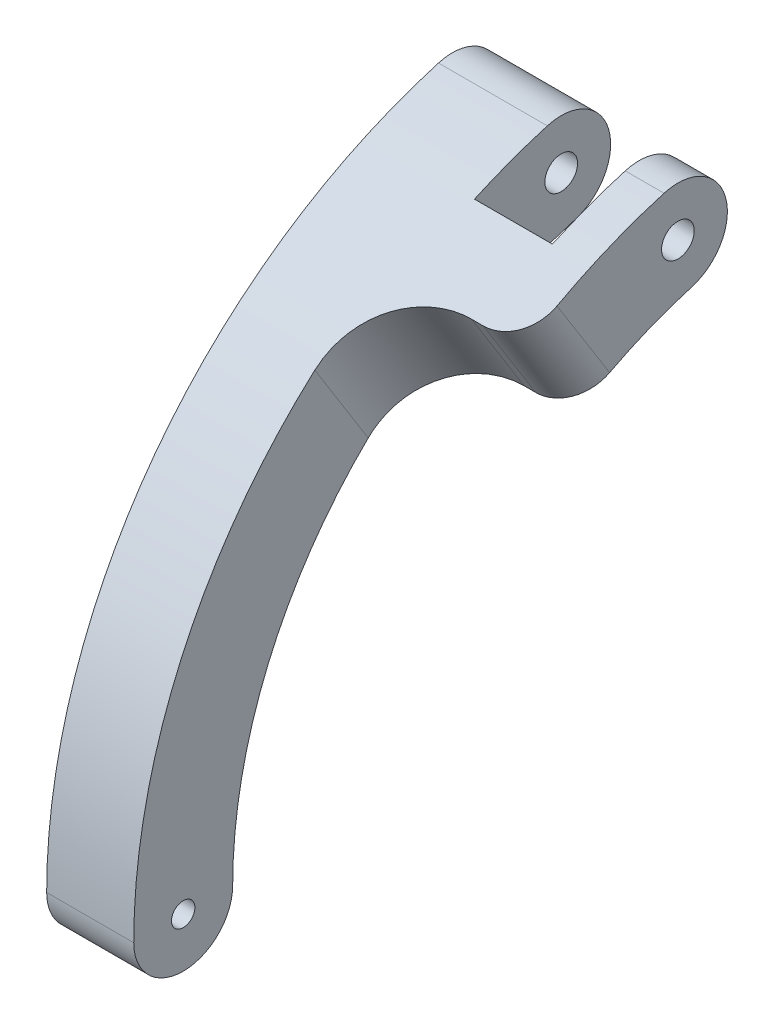
ISO-10303-21;
HEADER;
FILE_DESCRIPTION(('STEP AP214'),'2;1');
FILE_NAME('part.step','',(''),(''),'','','');
FILE_SCHEMA(('AUTOMOTIVE_DESIGN { 1 0 10303 214 1 1 1 1 }'));
ENDSEC;
DATA;
#1=APPLICATION_CONTEXT('core data for automotive mechanical design processes');
#2=APPLICATION_PROTOCOL_DEFINITION('international standard','automotive_design',2000,#1);
#3=PRODUCT_CONTEXT('',#1,'mechanical');
#4=PRODUCT('Part','Part','',(#3));
#5=PRODUCT_RELATED_PRODUCT_CATEGORY('part','',(#4));
#6=PRODUCT_DEFINITION_FORMATION('','',#4);
#7=PRODUCT_DEFINITION_CONTEXT('part definition',#1,'design');
#8=PRODUCT_DEFINITION('design','',#6,#7);
#9=PRODUCT_DEFINITION_SHAPE('','',#8);
#10=(LENGTH_UNIT() NAMED_UNIT(*) SI_UNIT(.MILLI.,.METRE.));
#11=(NAMED_UNIT(*) PLANE_ANGLE_UNIT() SI_UNIT($,.RADIAN.));
#12=(NAMED_UNIT(*) SI_UNIT($,.STERADIAN.) SOLID_ANGLE_UNIT());
#13=UNCERTAINTY_MEASURE_WITH_UNIT(LENGTH_MEASURE(1.E-05),#10,'distance_accuracy_value','');
#14=(GEOMETRIC_REPRESENTATION_CONTEXT(3) GLOBAL_UNCERTAINTY_ASSIGNED_CONTEXT((#13)) GLOBAL_UNIT_ASSIGNED_CONTEXT((#10,
#11,#12)) REPRESENTATION_CONTEXT('',''));
#15=CARTESIAN_POINT('',(0.,0.,0.));
#16=DIRECTION('',(0.,0.,1.));
#17=DIRECTION('',(1.,0.,0.));
#18=AXIS2_PLACEMENT_3D('',#15,#16,#17);
#19=CARTESIAN_POINT('',(5.588,0.,0.));
#20=DIRECTION('',(-1.,0.,0.));
#21=DIRECTION('',(0.,0.,1.));
#22=AXIS2_PLACEMENT_3D('',#19,#20,#21);
#23=CYLINDRICAL_SURFACE('',#22,28.575);
#24=CARTESIAN_POINT('',(14.478,0.,0.));
#25=DIRECTION('',(-1.,0.,0.));
#26=DIRECTION('',(0.,0.,-1.));
#27=AXIS2_PLACEMENT_3D('',#24,#25,#26);
#28=CIRCLE('',#27,28.575);
#29=CARTESIAN_POINT('',(14.478,25.3053289074532,13.2729406645858));
#30=VERTEX_POINT('',#29);
#31=CARTESIAN_POINT('',(14.478,27.432,8.00099999999999));
#32=VERTEX_POINT('',#31);
#33=EDGE_CURVE('E222',#30,#32,#28,.T.);
#34=ORIENTED_EDGE('',*,*,#33,.F.);
#35=CARTESIAN_POINT('',(14.478,25.3053289074532,13.2729406645858));
#36=CARTESIAN_POINT('',(14.4780069411029,25.2721962680013,13.3361147595674));
#37=CARTESIAN_POINT('',(14.4750121295149,25.2388236928847,13.3991602255743));
#38=CARTESIAN_POINT('',(14.4630619919268,25.1718487265518,13.524558058173));
#39=CARTESIAN_POINT('',(14.4541068394899,25.1382463420559,13.5869104448933));
#40=CARTESIAN_POINT('',(14.4302878817538,25.0710848786369,13.7104439773059));
#41=CARTESIAN_POINT('',(14.4154284830234,25.0375257861011,13.7716259609022));
#42=CARTESIAN_POINT('',(14.3799141891177,24.9707016491142,13.8924245159804));
#43=CARTESIAN_POINT('',(14.3592594016077,24.9374365992123,13.952041116521));
#44=CARTESIAN_POINT('',(14.2887546196299,24.8384431170109,14.1280006349831));
#45=CARTESIAN_POINT('',(14.2303567466913,24.7734953673275,14.2414917741396));
#46=CARTESIAN_POINT('',(14.0924954274718,24.6480706970933,14.4574856962185));
#47=CARTESIAN_POINT('',(14.0130361424429,24.5875928963983,14.559990644148));
#48=CARTESIAN_POINT('',(13.8353810632333,24.4732712575514,14.7513400739257));
#49=CARTESIAN_POINT('',(13.7372077336457,24.4194195915525,14.8402007060027));
#50=CARTESIAN_POINT('',(13.5248223470222,24.3202535377408,15.0021645364801));
#51=CARTESIAN_POINT('',(13.4106069360097,24.2749409398733,15.0752644316027));
#52=CARTESIAN_POINT('',(13.1691965709636,24.1945194967294,15.2040008347168));
#53=CARTESIAN_POINT('',(13.0419802956931,24.1594277884495,15.2596080256731));
#54=CARTESIAN_POINT('',(12.778346916188,24.1009320407776,15.3518305085021));
#55=CARTESIAN_POINT('',(12.6419350629992,24.0775213941386,15.3884565372865));
#56=CARTESIAN_POINT('',(12.4102751824999,24.0490054628536,15.4329649837049));
#57=CARTESIAN_POINT('',(12.3164645388069,24.040399477045,15.4463592014934));
#58=CARTESIAN_POINT('',(12.127782252452,24.0289084680319,15.4642236773029));
#59=CARTESIAN_POINT('',(12.0329122527581,24.0260155656994,15.4687062257991));
#60=CARTESIAN_POINT('',(11.938,24.0260275600579,15.4686982220011));
#61=B_SPLINE_CURVE_WITH_KNOTS('',3,(#35,#36,#37,#38,#39,#40,#41,#42,#43,#44,#45,#46,#47,#48,#49,
#50,#51,#52,#53,#54,#55,#56,#57,#58,#59,#60),.UNSPECIFIED.,.F.,.F.,(4,2,2,2,2,2,2,2,2,2,2,2,4),
(0.,0.213938095997272,0.427869962454853,0.641642462239762,0.855410990877023,1.28281628875417,
1.71013720401604,2.1369483514547,2.56384886706115,2.99146108446835,3.41883115338315,
3.70372919737966,3.98823405262445),.UNSPECIFIED.);
#62=CARTESIAN_POINT('',(11.938,24.0260275600579,15.4686982220011));
#63=VERTEX_POINT('',#62);
#64=EDGE_CURVE('E63',#30,#63,#61,.T.);
#65=ORIENTED_EDGE('',*,*,#64,.T.);
#66=DIRECTION('',(-1.,0.,0.));
#67=VECTOR('',#66,1.);
#68=CARTESIAN_POINT('',(14.478,24.0260275600579,15.4686982220011));
#69=LINE('',#68,#67);
#70=CARTESIAN_POINT('',(11.176,24.0260275600579,15.4686982220011));
#71=VERTEX_POINT('',#70);
#72=EDGE_CURVE('E228',#63,#71,#69,.T.);
#73=ORIENTED_EDGE('',*,*,#72,.T.);
#74=CARTESIAN_POINT('',(11.176,24.0260275600579,15.4686982220011));
#75=CARTESIAN_POINT('',(11.0189443629764,24.0260284332777,15.4686788654342));
#76=CARTESIAN_POINT('',(10.8618910731379,24.0224430341488,15.4742651522496));
#77=CARTESIAN_POINT('',(10.5489062384894,24.008105920638,15.4965092510779));
#78=CARTESIAN_POINT('',(10.3929746443452,23.9973545234021,15.5131665731193));
#79=CARTESIAN_POINT('',(10.0834399050987,23.9687012462103,15.5573981781409));
#80=CARTESIAN_POINT('',(9.92983526963643,23.9508041629074,15.5849651377482));
#81=CARTESIAN_POINT('',(9.62593998210242,23.907873810318,15.65074267659));
#82=CARTESIAN_POINT('',(9.4756492879101,23.8828406317884,15.6889531204606));
#83=CARTESIAN_POINT('',(9.17939860334885,23.8256522955397,15.7756651451388));
#84=CARTESIAN_POINT('',(9.03344008806987,23.7934947428421,15.8241701864181));
#85=CARTESIAN_POINT('',(8.74689392196116,23.722088316913,15.931016263881));
#86=CARTESIAN_POINT('',(8.6063082710728,23.6828368336611,15.9893609197554));
#87=CARTESIAN_POINT('',(8.33164307631833,23.5973333096359,16.1152806640735));
#88=CARTESIAN_POINT('',(8.19756010968896,23.5510850057125,16.1828508235088));
#89=CARTESIAN_POINT('',(7.93673522372253,23.4516431653654,16.3266254023096));
#90=CARTESIAN_POINT('',(7.80999586165839,23.3984472302947,16.4028328024477));
#91=CARTESIAN_POINT('',(7.56507284052024,23.2853637488259,16.5629720947831));
#92=CARTESIAN_POINT('',(7.44687202745146,23.2254902706038,16.646887684));
#93=CARTESIAN_POINT('',(7.21958464517373,23.0991300883425,16.8217849607818));
#94=CARTESIAN_POINT('',(7.11049801859021,23.0326434259397,16.9127666038583));
#95=CARTESIAN_POINT('',(6.90219413682489,22.8932604516201,17.1009637565337));
#96=CARTESIAN_POINT('',(6.80297901285836,22.8203627619622,17.1981806048682));
#97=CARTESIAN_POINT('',(6.61517930146587,22.6684749047004,17.3978906712501));
#98=CARTESIAN_POINT('',(6.52659095360645,22.5894869085875,17.5003820043918));
#99=CARTESIAN_POINT('',(6.3611039315446,22.4262180553295,17.7091168170224));
#100=CARTESIAN_POINT('',(6.28413977051865,22.3419709427783,17.8153347766679));
#101=CARTESIAN_POINT('',(6.14181650502212,22.1682061013237,18.0310965590451));
#102=CARTESIAN_POINT('',(6.07645319694866,22.0786902972673,18.1406391601656));
#103=CARTESIAN_POINT('',(5.95770249052425,21.894822885644,18.3621366021309));
#104=CARTESIAN_POINT('',(5.90431500301031,21.8004713140872,18.4740914250093));
#105=CARTESIAN_POINT('',(5.8098256925707,21.6075051497193,18.6994217168376));
#106=CARTESIAN_POINT('',(5.76872135185733,21.5088914353084,18.8127968896744));
#107=CARTESIAN_POINT('',(5.68519270960845,21.2682046996807,19.0850403227439));
#108=CARTESIAN_POINT('',(5.64865577417601,21.1243464226638,19.2441954329839));
#109=CARTESIAN_POINT('',(5.61221240016997,20.9046642090879,19.4817173075315));
#110=CARTESIAN_POINT('',(5.60312490596733,20.8308303534713,19.5606453506383));
#111=CARTESIAN_POINT('',(5.59101988453527,20.6820473965564,19.7178918027579));
#112=CARTESIAN_POINT('',(5.5880014520916,20.6070984632546,19.7962103009497));
#113=CARTESIAN_POINT('',(5.588,20.5316846845408,19.8741175656831));
#114=B_SPLINE_CURVE_WITH_KNOTS('',3,(#74,#75,#76,#77,#78,#79,#80,#81,#82,#83,#84,#85,#86,#87,
#88,#89,#90,#91,#92,#93,#94,#95,#96,#97,#98,#99,#100,#101,#102,#103,#104,#105,#106,#107,#108,
#109,#110,#111,#112,#113),.UNSPECIFIED.,.F.,.F.,(4,2,2,2,2,2,2,2,2,2,2,2,2,2,2,2,2,2,2,4),(0.,
0.471023403672035,0.942025962623213,1.41271288391272,1.88339381927011,2.35423322270134,
2.82524621276788,3.29600852733965,3.76693380284651,4.2368850396735,4.70683331789429,
5.17688283678181,5.64676552830284,6.11389349741349,6.58085185422207,7.04780673429303,
7.5146658326395,8.16586601224132,8.4910999267628,8.8162853283132),.UNSPECIFIED.);
#115=CARTESIAN_POINT('',(5.588,20.5316846845408,19.8741175656831));
#116=VERTEX_POINT('',#115);
#117=EDGE_CURVE('E180',#71,#116,#114,.T.);
#118=ORIENTED_EDGE('',*,*,#117,.T.);
#119=CARTESIAN_POINT('',(5.588,0.,0.));
#120=DIRECTION('',(-1.,0.,0.));
#121=DIRECTION('',(0.,0.,1.));
#122=AXIS2_PLACEMENT_3D('',#119,#120,#121);
#123=CIRCLE('',#122,28.575);
#124=CARTESIAN_POINT('',(5.588,0.,28.575));
#125=VERTEX_POINT('',#124);
#126=EDGE_CURVE('E252',#125,#116,#123,.T.);
#127=ORIENTED_EDGE('',*,*,#126,.F.);
#128=DIRECTION('',(-1.,0.,0.));
#129=VECTOR('',#128,1.);
#130=CARTESIAN_POINT('',(5.588,0.,28.575));
#131=LINE('',#130,#129);
#132=CARTESIAN_POINT('',(0.,0.,28.575));
#133=VERTEX_POINT('',#132);
#134=EDGE_CURVE('E167',#125,#133,#131,.T.);
#135=ORIENTED_EDGE('',*,*,#134,.T.);
#136=CARTESIAN_POINT('',(0.,0.,0.));
#137=DIRECTION('',(-1.,0.,0.));
#138=DIRECTION('',(0.,0.,1.));
#139=AXIS2_PLACEMENT_3D('',#136,#137,#138);
#140=CIRCLE('',#139,28.575);
#141=CARTESIAN_POINT('',(0.,27.432,8.00099999999999));
#142=VERTEX_POINT('',#141);
#143=EDGE_CURVE('E258',#133,#142,#140,.T.);
#144=ORIENTED_EDGE('',*,*,#143,.T.);
#145=DIRECTION('',(-1.,0.,0.));
#146=VECTOR('',#145,1.);
#147=CARTESIAN_POINT('',(5.588,27.432,8.00099999999999));
#148=LINE('',#147,#146);
#149=CARTESIAN_POINT('',(6.98778000002064,27.432,8.00099999999999));
#150=VERTEX_POINT('',#149);
#151=EDGE_CURVE('E158',#150,#142,#148,.T.);
#152=ORIENTED_EDGE('',*,*,#151,.F.);
#153=CARTESIAN_POINT('',(6.98778000002064,0.,0.));
#154=DIRECTION('',(-1.,0.,0.));
#155=DIRECTION('',(0.,1.,0.));
#156=AXIS2_PLACEMENT_3D('',#153,#154,#155);
#157=CIRCLE('',#156,28.575);
#158=CARTESIAN_POINT('',(6.98778000002064,25.9985341755408,11.8577757494075));
#159=VERTEX_POINT('',#158);
#160=EDGE_CURVE('E135',#159,#150,#157,.T.);
#161=ORIENTED_EDGE('',*,*,#160,.F.);
#162=DIRECTION('',(1.,0.,0.));
#163=VECTOR('',#162,1.);
#164=CARTESIAN_POINT('',(6.98778000002064,25.9985341755408,11.8577757494075));
#165=LINE('',#164,#163);
#166=CARTESIAN_POINT('',(11.9877800000206,25.9985341755408,11.8577757494075));
#167=VERTEX_POINT('',#166);
#168=EDGE_CURVE('E436',#159,#167,#165,.T.);
#169=ORIENTED_EDGE('',*,*,#168,.T.);
#170=CARTESIAN_POINT('',(11.9877800000206,0.,0.));
#171=DIRECTION('',(-1.,0.,0.));
#172=DIRECTION('',(0.,1.,0.));
#173=AXIS2_PLACEMENT_3D('',#170,#171,#172);
#174=CIRCLE('',#173,28.575);
#175=CARTESIAN_POINT('',(11.9877800000206,27.432,8.00099999999999));
#176=VERTEX_POINT('',#175);
#177=EDGE_CURVE('E139',#167,#176,#174,.T.);
#178=ORIENTED_EDGE('',*,*,#177,.T.);
#179=EDGE_CURVE('E164',#32,#176,#148,.T.);
#180=ORIENTED_EDGE('',*,*,#179,.F.);
#181=EDGE_LOOP('',(#34,#65,#73,#118,#127,#135,#144,#152,#161,#169,#178,#180));
#182=FACE_BOUND('',#181,.T.);
#183=ADVANCED_FACE('F35',(#182),#23,.F.);
#184=CARTESIAN_POINT('',(5.588,30.48,8.88999999999999));
#185=DIRECTION('',(-1.,0.,0.));
#186=DIRECTION('',(0.,0.,1.));
#187=AXIS2_PLACEMENT_3D('',#184,#185,#186);
#188=CYLINDRICAL_SURFACE('',#187,3.175);
#189=CARTESIAN_POINT('',(6.98778000002063,30.48,8.88999999999999));
#190=DIRECTION('',(1.,0.,0.));
#191=DIRECTION('',(0.,1.,0.));
#192=AXIS2_PLACEMENT_3D('',#189,#190,#191);
#193=CIRCLE('',#192,3.175);
#194=CARTESIAN_POINT('',(6.98778000002063,33.528,9.77899999999999));
#195=VERTEX_POINT('',#194);
#196=EDGE_CURVE('E128',#150,#195,#193,.T.);
#197=ORIENTED_EDGE('',*,*,#196,.F.);
#198=ORIENTED_EDGE('',*,*,#151,.T.);
#199=CARTESIAN_POINT('',(0.,30.48,8.88999999999999));
#200=DIRECTION('',(1.,0.,0.));
#201=DIRECTION('',(0.,0.,-1.));
#202=AXIS2_PLACEMENT_3D('',#199,#200,#201);
#203=CIRCLE('',#202,3.175);
#204=CARTESIAN_POINT('',(0.,33.528,9.77899999999999));
#205=VERTEX_POINT('',#204);
#206=EDGE_CURVE('E152',#142,#205,#203,.T.);
#207=ORIENTED_EDGE('',*,*,#206,.T.);
#208=DIRECTION('',(-1.,0.,0.));
#209=VECTOR('',#208,1.);
#210=CARTESIAN_POINT('',(5.588,33.528,9.77899999999999));
#211=LINE('',#210,#209);
#212=EDGE_CURVE('E143',#195,#205,#211,.T.);
#213=ORIENTED_EDGE('',*,*,#212,.F.);
#214=EDGE_LOOP('',(#197,#198,#207,#213));
#215=FACE_BOUND('',#214,.T.);
#216=ADVANCED_FACE('F150',(#215),#188,.T.);
#217=CARTESIAN_POINT('',(5.588,0.,0.));
#218=DIRECTION('',(-1.,0.,0.));
#219=DIRECTION('',(0.,0.,1.));
#220=AXIS2_PLACEMENT_3D('',#217,#218,#219);
#221=CYLINDRICAL_SURFACE('',#220,34.925);
#222=DIRECTION('',(-1.,0.,0.));
#223=VECTOR('',#222,1.);
#224=CARTESIAN_POINT('',(14.478,29.4100464778108,18.8362626646851));
#225=LINE('',#224,#223);
#226=CARTESIAN_POINT('',(11.938,29.4100464778108,18.8362626646851));
#227=VERTEX_POINT('',#226);
#228=CARTESIAN_POINT('',(11.176,29.4100464778108,18.8362626646851));
#229=VERTEX_POINT('',#228);
#230=EDGE_CURVE('E231',#227,#229,#225,.T.);
#231=ORIENTED_EDGE('',*,*,#230,.F.);
#232=CARTESIAN_POINT('',(11.938,29.4100464778108,18.8362626646851));
#233=CARTESIAN_POINT('',(12.0094409119174,29.4100414000498,18.8362675649945));
#234=CARTESIAN_POINT('',(12.0808785676551,29.4116721070238,18.8337244053585));
#235=CARTESIAN_POINT('',(12.2232426733763,29.4181664337427,18.8235802947337));
#236=CARTESIAN_POINT('',(12.2941691480112,29.4230298965214,18.8159795893134));
#237=CARTESIAN_POINT('',(12.4349601076135,29.4359462114002,18.7957663358375));
#238=CARTESIAN_POINT('',(12.5048253533608,29.443996654722,18.7831575729397));
#239=CARTESIAN_POINT('',(12.6430302961958,29.4632017233853,18.7530180346529));
#240=CARTESIAN_POINT('',(12.7113700116286,29.4743563113765,18.7354873184869));
#241=CARTESIAN_POINT('',(12.913441420816,29.5123486594905,18.6756304409306));
#242=CARTESIAN_POINT('',(13.0442828482824,29.5437203424077,18.6260312792102));
#243=CARTESIAN_POINT('',(13.2941608159098,29.6173348006966,18.508750992486));
#244=CARTESIAN_POINT('',(13.4131993821821,29.6595757057366,18.4410729783415));
#245=CARTESIAN_POINT('',(13.6362013213281,29.7533896913996,18.2893237350488));
#246=CARTESIAN_POINT('',(13.7401662491594,29.8049618082032,18.2052541989086));
#247=CARTESIAN_POINT('',(13.9300722298509,29.9156060582513,18.0228602110457));
#248=CARTESIAN_POINT('',(14.0160101122479,29.9746795078468,17.9245332569682));
#249=CARTESIAN_POINT('',(14.1673440736652,30.0982161523974,17.7163099853287));
#250=CARTESIAN_POINT('',(14.2327555343954,30.1626752654549,17.6064224137006));
#251=CARTESIAN_POINT('',(14.3412545336065,30.2948656954358,17.3779775536008));
#252=CARTESIAN_POINT('',(14.3843545997156,30.3625951526845,17.259425173104));
#253=CARTESIAN_POINT('',(14.4364206225228,30.4759293186941,17.0581891141272));
#254=CARTESIAN_POINT('',(14.4520071208805,30.5212401588689,16.9769899693096));
#255=CARTESIAN_POINT('',(14.4727956996765,30.6116990702848,16.8133376552112));
#256=CARTESIAN_POINT('',(14.4780126114783,30.6568472816726,16.7308864471729));
#257=CARTESIAN_POINT('',(14.478,30.7016713515766,16.6482131539628));
#258=B_SPLINE_CURVE_WITH_KNOTS('',3,(#232,#233,#234,#235,#236,#237,#238,#239,#240,#241,#242,
#243,#244,#245,#246,#247,#248,#249,#250,#251,#252,#253,#254,#255,#256,#257),.UNSPECIFIED.,.F.,
.F.,(4,2,2,2,2,2,2,2,2,2,2,2,4),(0.,0.214253010959329,0.428495619650908,0.642576608067726,
0.85665502068659,1.28463912568623,1.71254963410484,2.14041596892251,2.5683574907262,
2.9959775595881,3.42335726285104,3.70566472570144,3.987568119783),.UNSPECIFIED.);
#259=CARTESIAN_POINT('',(14.478,30.7016713515766,16.6482131539628));
#260=VERTEX_POINT('',#259);
#261=EDGE_CURVE('E11',#227,#260,#258,.T.);
#262=ORIENTED_EDGE('',*,*,#261,.T.);
#263=CARTESIAN_POINT('',(14.478,0.,0.));
#264=DIRECTION('',(1.,0.,0.));
#265=DIRECTION('',(0.,0.,-1.));
#266=AXIS2_PLACEMENT_3D('',#263,#264,#265);
#267=CIRCLE('',#266,34.925);
#268=CARTESIAN_POINT('',(14.478,33.528,9.77899999999999));
#269=VERTEX_POINT('',#268);
#270=EDGE_CURVE('E229',#269,#260,#267,.T.);
#271=ORIENTED_EDGE('',*,*,#270,.F.);
#272=CARTESIAN_POINT('',(11.9877800000206,33.528,9.77899999999999));
#273=VERTEX_POINT('',#272);
#274=EDGE_CURVE('E154',#269,#273,#211,.T.);
#275=ORIENTED_EDGE('',*,*,#274,.T.);
#276=CARTESIAN_POINT('',(11.9877800000206,0.,0.));
#277=DIRECTION('',(1.,0.,0.));
#278=DIRECTION('',(0.,1.,0.));
#279=AXIS2_PLACEMENT_3D('',#276,#277,#278);
#280=CIRCLE('',#279,34.925);
#281=CARTESIAN_POINT('',(11.9877800000206,31.7932056476725,14.4550233360174));
#282=VERTEX_POINT('',#281);
#283=EDGE_CURVE('E434',#273,#282,#280,.T.);
#284=ORIENTED_EDGE('',*,*,#283,.T.);
#285=DIRECTION('',(1.,0.,0.));
#286=VECTOR('',#285,1.);
#287=CARTESIAN_POINT('',(6.98778000002064,31.7932056476725,14.4550233360174));
#288=LINE('',#287,#286);
#289=CARTESIAN_POINT('',(6.98778000002064,31.7932056476725,14.4550233360174));
#290=VERTEX_POINT('',#289);
#291=EDGE_CURVE('E147',#290,#282,#288,.T.);
#292=ORIENTED_EDGE('',*,*,#291,.F.);
#293=CARTESIAN_POINT('',(6.98778000002064,0.,0.));
#294=DIRECTION('',(1.,0.,0.));
#295=DIRECTION('',(0.,1.,0.));
#296=AXIS2_PLACEMENT_3D('',#293,#294,#295);
#297=CIRCLE('',#296,34.925);
#298=EDGE_CURVE('E132',#195,#290,#297,.T.);
#299=ORIENTED_EDGE('',*,*,#298,.F.);
#300=ORIENTED_EDGE('',*,*,#212,.T.);
#301=CARTESIAN_POINT('',(0.,0.,0.));
#302=DIRECTION('',(1.,0.,0.));
#303=DIRECTION('',(0.,0.,1.));
#304=AXIS2_PLACEMENT_3D('',#301,#302,#303);
#305=CIRCLE('',#304,34.925);
#306=CARTESIAN_POINT('',(0.,0.,34.925));
#307=VERTEX_POINT('',#306);
#308=EDGE_CURVE('E253',#205,#307,#305,.T.);
#309=ORIENTED_EDGE('',*,*,#308,.T.);
#310=DIRECTION('',(-1.,0.,0.));
#311=VECTOR('',#310,1.);
#312=CARTESIAN_POINT('',(5.588,0.,34.925));
#313=LINE('',#312,#311);
#314=CARTESIAN_POINT('',(5.588,0.,34.925));
#315=VERTEX_POINT('',#314);
#316=EDGE_CURVE('E155',#315,#307,#313,.T.);
#317=ORIENTED_EDGE('',*,*,#316,.F.);
#318=CARTESIAN_POINT('',(5.588,0.,0.));
#319=DIRECTION('',(1.,0.,0.));
#320=DIRECTION('',(0.,0.,1.));
#321=AXIS2_PLACEMENT_3D('',#318,#319,#320);
#322=CIRCLE('',#321,34.925);
#323=CARTESIAN_POINT('',(5.588,26.0138766070834,23.3030866811983));
#324=VERTEX_POINT('',#323);
#325=EDGE_CURVE('E160',#324,#315,#322,.T.);
#326=ORIENTED_EDGE('',*,*,#325,.F.);
#327=CARTESIAN_POINT('',(5.588,26.0138766070834,23.3030866811983));
#328=CARTESIAN_POINT('',(5.58798276179189,26.1188287379726,23.1859413739827));
#329=CARTESIAN_POINT('',(5.59444628190049,26.2229774802753,23.0680697935045));
#330=CARTESIAN_POINT('',(5.6203053964979,26.4289908580178,22.8317420806889));
#331=CARTESIAN_POINT('',(5.63970157176473,26.5308553906662,22.7132859223364));
#332=CARTESIAN_POINT('',(5.69138372879501,26.7315636762443,22.4767264155054));
#333=CARTESIAN_POINT('',(5.72366331171526,26.8304089025849,22.358622921162));
#334=CARTESIAN_POINT('',(5.80095296484982,27.0244988965965,22.1236365307063));
#335=CARTESIAN_POINT('',(5.84596250947137,27.1197438127325,22.0067535844069));
#336=CARTESIAN_POINT('',(5.9484968803358,27.3061292782987,21.7750558608582));
#337=CARTESIAN_POINT('',(6.00603146305291,27.3972665608783,21.6602427718601));
#338=CARTESIAN_POINT('',(6.1332552822961,27.5748638660381,21.4336938820451));
#339=CARTESIAN_POINT('',(6.20294900994562,27.6613221448587,21.3219592360068));
#340=CARTESIAN_POINT('',(6.35395775359084,27.8289986628169,21.1026420781528));
#341=CARTESIAN_POINT('',(6.43526467525847,27.9102204949723,20.9950567400765));
#342=CARTESIAN_POINT('',(6.60900411534192,28.0671101776836,20.7848541115506));
#343=CARTESIAN_POINT('',(6.70144048757765,28.1427760896933,20.6822385593472));
#344=CARTESIAN_POINT('',(6.89595874951292,28.2875762184493,20.4837405901849));
#345=CARTESIAN_POINT('',(6.99795504885518,28.3567590407728,20.3878097340211));
#346=CARTESIAN_POINT('',(7.21150943792032,28.4890046960921,20.2026034835837));
#347=CARTESIAN_POINT('',(7.32306753101731,28.5520675269282,20.1133280916584));
#348=CARTESIAN_POINT('',(7.55500554741352,28.6718639133576,19.942185518052));
#349=CARTESIAN_POINT('',(7.67538910382556,28.7285948378252,19.8603214186677));
#350=CARTESIAN_POINT('',(7.92404273347398,28.8354902855855,19.7047971064401));
#351=CARTESIAN_POINT('',(8.05231010732684,28.8856570382154,19.6311341095961));
#352=CARTESIAN_POINT('',(8.31617098235646,28.9794072441768,19.492475586459));
#353=CARTESIAN_POINT('',(8.45178090112021,29.0229750414212,19.4275007142988));
#354=CARTESIAN_POINT('',(8.72903837003443,29.1032556404418,19.307029187589));
#355=CARTESIAN_POINT('',(8.87068373763172,29.1399708948389,19.2515291424753));
#356=CARTESIAN_POINT('',(9.15902991416401,29.2064705088282,19.1504926210468));
#357=CARTESIAN_POINT('',(9.30572949547395,29.2362565380325,19.1049537447247));
#358=CARTESIAN_POINT('',(9.60311758884756,29.2888368956724,19.0242468577221));
#359=CARTESIAN_POINT('',(9.75380521533053,29.3116327624171,18.9890765653171));
#360=CARTESIAN_POINT('',(10.1140899354151,29.3572779369622,18.9184638286525));
#361=CARTESIAN_POINT('',(10.3250216135559,29.3770799829232,18.8876532300835));
#362=CARTESIAN_POINT('',(10.6432576091062,29.3968656741564,18.8568299777192));
#363=CARTESIAN_POINT('',(10.7495960828571,29.401808011651,18.8491210124724));
#364=CARTESIAN_POINT('',(10.9626135132669,29.408397407682,18.8388377879398));
#365=CARTESIAN_POINT('',(11.069292439226,29.4100447553743,18.8362630780915));
#366=CARTESIAN_POINT('',(11.176,29.4100464778108,18.8362626646851));
#367=B_SPLINE_CURVE_WITH_KNOTS('',3,(#327,#328,#329,#330,#331,#332,#333,#334,#335,#336,#337,
#338,#339,#340,#341,#342,#343,#344,#345,#346,#347,#348,#349,#350,#351,#352,#353,#354,#355,#356,
#357,#358,#359,#360,#361,#362,#363,#364,#365,#366),.UNSPECIFIED.,.F.,.F.,(4,2,2,2,2,2,2,2,2,2,2,
2,2,2,2,2,2,2,2,4),(0.,0.471720109979165,0.943461405331091,1.41496869041861,1.88645651082485,
2.35831292288288,2.83034399108067,3.30204764748624,3.77391511409348,4.24190136100837,
4.70988777306364,5.17806793126455,5.6460886701711,6.11520296262455,6.58414902916766,
7.05298198481628,7.52171169130719,8.16236743434077,8.48241729294375,8.80243906396188),.UNSPECIFIED.);
#368=EDGE_CURVE('E187',#324,#229,#367,.T.);
#369=ORIENTED_EDGE('',*,*,#368,.T.);
#370=EDGE_LOOP('',(#231,#262,#271,#275,#284,#292,#299,#300,#309,#317,#326,#369));
#371=FACE_BOUND('',#370,.T.);
#372=ADVANCED_FACE('F142',(#371),#221,.T.);
#373=CARTESIAN_POINT('',(5.588,0.,15.875));
#374=DIRECTION('',(1.,0.,0.));
#375=DIRECTION('',(0.,0.,-1.));
#376=AXIS2_PLACEMENT_3D('',#373,#374,#375);
#377=PLANE('',#376);
#378=ORIENTED_EDGE('',*,*,#126,.T.);
#379=DIRECTION('',(0.,-0.847817598968045,-0.53028795845282));
#380=VECTOR('',#379,1.);
#381=CARTESIAN_POINT('',(5.588,3.97566581547898,9.51875639263434));
#382=LINE('',#381,#380);
#383=EDGE_CURVE('E178',#116,#324,#382,.F.);
#384=ORIENTED_EDGE('',*,*,#383,.T.);
#385=ORIENTED_EDGE('',*,*,#325,.T.);
#386=CARTESIAN_POINT('',(5.588,0.,31.75));
#387=DIRECTION('',(1.,0.,0.));
#388=DIRECTION('',(0.,0.,-1.));
#389=AXIS2_PLACEMENT_3D('',#386,#387,#388);
#390=CIRCLE('',#389,3.175);
#391=EDGE_CURVE('E249',#315,#125,#390,.T.);
#392=ORIENTED_EDGE('',*,*,#391,.T.);
#393=EDGE_LOOP('',(#378,#384,#385,#392));
#394=FACE_BOUND('',#393,.T.);
#395=CARTESIAN_POINT('',(5.588,0.,31.75));
#396=DIRECTION('',(1.,0.,0.));
#397=DIRECTION('',(0.,0.,-1.));
#398=AXIS2_PLACEMENT_3D('',#395,#396,#397);
#399=CIRCLE('',#398,0.750000000000002);
#400=CARTESIAN_POINT('',(5.588,0.,31.));
#401=VERTEX_POINT('',#400);
#402=EDGE_CURVE('E240',#401,#401,#399,.T.);
#403=ORIENTED_EDGE('',*,*,#402,.F.);
#404=EDGE_LOOP('',(#403));
#405=FACE_BOUND('',#404,.T.);
#406=ADVANCED_FACE('F213',(#394,#405),#377,.T.);
#407=CARTESIAN_POINT('',(0.,0.,15.875));
#408=DIRECTION('',(1.,0.,0.));
#409=DIRECTION('',(0.,0.,-1.));
#410=AXIS2_PLACEMENT_3D('',#407,#408,#409);
#411=PLANE('',#410);
#412=CARTESIAN_POINT('',(0.,0.,31.75));
#413=DIRECTION('',(1.,0.,0.));
#414=DIRECTION('',(0.,0.,-1.));
#415=AXIS2_PLACEMENT_3D('',#412,#413,#414);
#416=CIRCLE('',#415,3.175);
#417=EDGE_CURVE('E248',#307,#133,#416,.T.);
#418=ORIENTED_EDGE('',*,*,#417,.F.);
#419=ORIENTED_EDGE('',*,*,#308,.F.);
#420=ORIENTED_EDGE('',*,*,#206,.F.);
#421=ORIENTED_EDGE('',*,*,#143,.F.);
#422=EDGE_LOOP('',(#418,#419,#420,#421));
#423=FACE_BOUND('',#422,.T.);
#424=CARTESIAN_POINT('',(0.,30.48,8.88999999999999));
#425=DIRECTION('',(1.,0.,0.));
#426=DIRECTION('',(0.,0.,-1.));
#427=AXIS2_PLACEMENT_3D('',#424,#425,#426);
#428=CIRCLE('',#427,1.05);
#429=CARTESIAN_POINT('',(0.,30.48,7.83999999999999));
#430=VERTEX_POINT('',#429);
#431=EDGE_CURVE('E243',#430,#430,#428,.T.);
#432=ORIENTED_EDGE('',*,*,#431,.T.);
#433=EDGE_LOOP('',(#432));
#434=FACE_BOUND('',#433,.T.);
#435=CARTESIAN_POINT('',(0.,0.,31.75));
#436=DIRECTION('',(1.,0.,0.));
#437=DIRECTION('',(0.,0.,-1.));
#438=AXIS2_PLACEMENT_3D('',#435,#436,#437);
#439=CIRCLE('',#438,0.750000000000002);
#440=CARTESIAN_POINT('',(0.,0.,31.));
#441=VERTEX_POINT('',#440);
#442=EDGE_CURVE('E239',#441,#441,#439,.T.);
#443=ORIENTED_EDGE('',*,*,#442,.T.);
#444=EDGE_LOOP('',(#443));
#445=FACE_BOUND('',#444,.T.);
#446=ADVANCED_FACE('F205',(#423,#434,#445),#411,.F.);
#447=CARTESIAN_POINT('',(5.588,0.,31.75));
#448=DIRECTION('',(-1.,0.,0.));
#449=DIRECTION('',(0.,0.,1.));
#450=AXIS2_PLACEMENT_3D('',#447,#448,#449);
#451=CYLINDRICAL_SURFACE('',#450,3.175);
#452=ORIENTED_EDGE('',*,*,#417,.T.);
#453=ORIENTED_EDGE('',*,*,#134,.F.);
#454=ORIENTED_EDGE('',*,*,#391,.F.);
#455=ORIENTED_EDGE('',*,*,#316,.T.);
#456=EDGE_LOOP('',(#452,#453,#454,#455));
#457=FACE_BOUND('',#456,.T.);
#458=ADVANCED_FACE('F201',(#457),#451,.T.);
#459=ORIENTED_EDGE('',*,*,#179,.T.);
#460=CARTESIAN_POINT('',(11.9877800000206,30.48,8.88999999999999));
#461=DIRECTION('',(1.,0.,0.));
#462=DIRECTION('',(0.,1.,0.));
#463=AXIS2_PLACEMENT_3D('',#460,#461,#462);
#464=CIRCLE('',#463,3.175);
#465=EDGE_CURVE('E432',#176,#273,#464,.T.);
#466=ORIENTED_EDGE('',*,*,#465,.T.);
#467=ORIENTED_EDGE('',*,*,#274,.F.);
#468=CARTESIAN_POINT('',(14.478,30.48,8.88999999999999));
#469=DIRECTION('',(1.,0.,0.));
#470=DIRECTION('',(0.,0.,-1.));
#471=AXIS2_PLACEMENT_3D('',#468,#469,#470);
#472=CIRCLE('',#471,3.175);
#473=EDGE_CURVE('E234',#32,#269,#472,.T.);
#474=ORIENTED_EDGE('',*,*,#473,.F.);
#475=EDGE_LOOP('',(#459,#466,#467,#474));
#476=FACE_BOUND('',#475,.T.);
#477=ADVANCED_FACE('F204',(#476),#188,.T.);
#478=CARTESIAN_POINT('',(5.588,30.48,8.88999999999999));
#479=DIRECTION('',(-1.,0.,0.));
#480=DIRECTION('',(0.,0.,1.));
#481=AXIS2_PLACEMENT_3D('',#478,#479,#480);
#482=CYLINDRICAL_SURFACE('',#481,1.05);
#483=ORIENTED_EDGE('',*,*,#431,.F.);
#484=EDGE_LOOP('',(#483));
#485=FACE_BOUND('',#484,.T.);
#486=CARTESIAN_POINT('',(6.98778000002063,30.48,8.88999999999999));
#487=DIRECTION('',(1.,0.,0.));
#488=DIRECTION('',(0.,1.,0.));
#489=AXIS2_PLACEMENT_3D('',#486,#487,#488);
#490=CIRCLE('',#489,1.05);
#491=CARTESIAN_POINT('',(6.98778000002063,31.53,8.88999999999999));
#492=VERTEX_POINT('',#491);
#493=EDGE_CURVE('E174',#492,#492,#490,.T.);
#494=ORIENTED_EDGE('',*,*,#493,.T.);
#495=EDGE_LOOP('',(#494));
#496=FACE_BOUND('',#495,.T.);
#497=ADVANCED_FACE('F211',(#485,#496),#482,.F.);
#498=CARTESIAN_POINT('',(5.588,0.,31.75));
#499=DIRECTION('',(-1.,0.,0.));
#500=DIRECTION('',(0.,0.,1.));
#501=AXIS2_PLACEMENT_3D('',#498,#499,#500);
#502=CYLINDRICAL_SURFACE('',#501,0.750000000000002);
#503=ORIENTED_EDGE('',*,*,#402,.T.);
#504=EDGE_LOOP('',(#503));
#505=FACE_BOUND('',#504,.T.);
#506=ORIENTED_EDGE('',*,*,#442,.F.);
#507=EDGE_LOOP('',(#506));
#508=FACE_BOUND('',#507,.T.);
#509=ADVANCED_FACE('F295',(#505,#508),#502,.F.);
#510=CARTESIAN_POINT('',(14.478,30.48,8.88999999999999));
#511=DIRECTION('',(1.,0.,0.));
#512=DIRECTION('',(0.,0.,-1.));
#513=AXIS2_PLACEMENT_3D('',#510,#511,#512);
#514=PLANE('',#513);
#515=CARTESIAN_POINT('',(14.478,30.48,8.88999999999999));
#516=DIRECTION('',(-1.,0.,0.));
#517=DIRECTION('',(0.,0.,1.));
#518=AXIS2_PLACEMENT_3D('',#515,#516,#517);
#519=CIRCLE('',#518,1.05);
#520=CARTESIAN_POINT('',(14.478,30.48,9.93999999999999));
#521=VERTEX_POINT('',#520);
#522=EDGE_CURVE('E175',#521,#521,#519,.T.);
#523=ORIENTED_EDGE('',*,*,#522,.T.);
#524=EDGE_LOOP('',(#523));
#525=FACE_BOUND('',#524,.T.);
#526=ORIENTED_EDGE('',*,*,#270,.T.);
#527=DIRECTION('',(0.,-0.847817598968045,-0.53028795845282));
#528=VECTOR('',#527,1.);
#529=CARTESIAN_POINT('',(14.478,25.372958974528,13.3152415206223));
#530=LINE('',#529,#528);
#531=EDGE_CURVE('E274',#260,#30,#530,.T.);
#532=ORIENTED_EDGE('',*,*,#531,.T.);
#533=ORIENTED_EDGE('',*,*,#33,.T.);
#534=ORIENTED_EDGE('',*,*,#473,.T.);
#535=EDGE_LOOP('',(#526,#532,#533,#534));
#536=FACE_BOUND('',#535,.T.);
#537=ADVANCED_FACE('F281',(#525,#536),#514,.T.);
#538=CARTESIAN_POINT('',(14.478,24.0260275600579,15.4686982220011));
#539=DIRECTION('',(0.,0.53028795845282,-0.847817598968045));
#540=DIRECTION('',(0.,0.847817598968045,0.53028795845282));
#541=AXIS2_PLACEMENT_3D('',#538,#539,#540);
#542=PLANE('',#541);
#543=ORIENTED_EDGE('',*,*,#72,.F.);
#544=DIRECTION('',(0.,-0.847817598968045,-0.53028795845282));
#545=VECTOR('',#544,1.);
#546=CARTESIAN_POINT('',(11.938,29.4100464778108,18.8362626646851));
#547=LINE('',#546,#545);
#548=EDGE_CURVE('E49',#63,#227,#547,.F.);
#549=ORIENTED_EDGE('',*,*,#548,.T.);
#550=ORIENTED_EDGE('',*,*,#230,.T.);
#551=DIRECTION('',(0.,-0.847817598968045,-0.53028795845282));
#552=VECTOR('',#551,1.);
#553=CARTESIAN_POINT('',(11.176,24.0260275600579,15.4686982220011));
#554=LINE('',#553,#552);
#555=EDGE_CURVE('E170',#229,#71,#554,.T.);
#556=ORIENTED_EDGE('',*,*,#555,.T.);
#557=EDGE_LOOP('',(#543,#549,#550,#556));
#558=FACE_BOUND('',#557,.T.);
#559=ADVANCED_FACE('F285',(#558),#542,.F.);
#560=CARTESIAN_POINT('',(6.98778000002064,25.9985341755408,11.8577757494075));
#561=DIRECTION('',(0.,-0.409008204259607,0.912530705701639));
#562=DIRECTION('',(0.,-0.912530705701639,-0.409008204259607));
#563=AXIS2_PLACEMENT_3D('',#560,#561,#562);
#564=PLANE('',#563);
#565=DIRECTION('',(0.,-0.912530705701639,-0.409008204259607));
#566=VECTOR('',#565,1.);
#567=CARTESIAN_POINT('',(11.9877800000206,25.9985341755408,11.8577757494075));
#568=LINE('',#567,#566);
#569=EDGE_CURVE('E437',#282,#167,#568,.T.);
#570=ORIENTED_EDGE('',*,*,#569,.T.);
#571=ORIENTED_EDGE('',*,*,#168,.F.);
#572=DIRECTION('',(0.,-0.912530705701639,-0.409008204259607));
#573=VECTOR('',#572,1.);
#574=CARTESIAN_POINT('',(6.98778000002064,25.9985341755408,11.8577757494075));
#575=LINE('',#574,#573);
#576=EDGE_CURVE('E148',#290,#159,#575,.T.);
#577=ORIENTED_EDGE('',*,*,#576,.F.);
#578=ORIENTED_EDGE('',*,*,#291,.T.);
#579=EDGE_LOOP('',(#570,#571,#577,#578));
#580=FACE_BOUND('',#579,.T.);
#581=ADVANCED_FACE('F287',(#580),#564,.F.);
#582=CARTESIAN_POINT('',(6.98778000002063,30.48,8.88999999999999));
#583=DIRECTION('',(1.,0.,0.));
#584=DIRECTION('',(0.,1.,0.));
#585=AXIS2_PLACEMENT_3D('',#582,#583,#584);
#586=PLANE('',#585);
#587=ORIENTED_EDGE('',*,*,#493,.F.);
#588=EDGE_LOOP('',(#587));
#589=FACE_BOUND('',#588,.T.);
#590=ORIENTED_EDGE('',*,*,#196,.T.);
#591=ORIENTED_EDGE('',*,*,#298,.T.);
#592=ORIENTED_EDGE('',*,*,#576,.T.);
#593=ORIENTED_EDGE('',*,*,#160,.T.);
#594=EDGE_LOOP('',(#590,#591,#592,#593));
#595=FACE_BOUND('',#594,.T.);
#596=ADVANCED_FACE('F130',(#589,#595),#586,.T.);
#597=CARTESIAN_POINT('',(11.9877800000206,30.48,8.88999999999999));
#598=DIRECTION('',(1.,0.,0.));
#599=DIRECTION('',(0.,1.,0.));
#600=AXIS2_PLACEMENT_3D('',#597,#598,#599);
#601=PLANE('',#600);
#602=CARTESIAN_POINT('',(11.9877800000206,30.48,8.88999999999999));
#603=DIRECTION('',(1.,0.,0.));
#604=DIRECTION('',(0.,1.,0.));
#605=AXIS2_PLACEMENT_3D('',#602,#603,#604);
#606=CIRCLE('',#605,1.05);
#607=CARTESIAN_POINT('',(11.9877800000206,31.53,8.88999999999999));
#608=VERTEX_POINT('',#607);
#609=EDGE_CURVE('E171',#608,#608,#606,.T.);
#610=ORIENTED_EDGE('',*,*,#609,.T.);
#611=EDGE_LOOP('',(#610));
#612=FACE_BOUND('',#611,.T.);
#613=ORIENTED_EDGE('',*,*,#465,.F.);
#614=ORIENTED_EDGE('',*,*,#177,.F.);
#615=ORIENTED_EDGE('',*,*,#569,.F.);
#616=ORIENTED_EDGE('',*,*,#283,.F.);
#617=EDGE_LOOP('',(#613,#614,#615,#616));
#618=FACE_BOUND('',#617,.T.);
#619=ADVANCED_FACE('F373',(#612,#618),#601,.F.);
#620=CARTESIAN_POINT('',(14.478,30.48,8.88999999999999));
#621=DIRECTION('',(-1.,0.,0.));
#622=DIRECTION('',(0.,0.,1.));
#623=AXIS2_PLACEMENT_3D('',#620,#621,#622);
#624=CYLINDRICAL_SURFACE('',#623,1.05);
#625=ORIENTED_EDGE('',*,*,#522,.F.);
#626=EDGE_LOOP('',(#625));
#627=FACE_BOUND('',#626,.T.);
#628=ORIENTED_EDGE('',*,*,#609,.F.);
#629=EDGE_LOOP('',(#628));
#630=FACE_BOUND('',#629,.T.);
#631=ADVANCED_FACE('F199',(#627,#630),#624,.F.);
#632=CARTESIAN_POINT('',(11.176,21.0627784482235,20.2063029650345));
#633=DIRECTION('',(0.,-0.847817598968045,-0.53028795845282));
#634=DIRECTION('',(0.,0.53028795845282,-0.847817598968045));
#635=AXIS2_PLACEMENT_3D('',#632,#633,#634);
#636=CYLINDRICAL_SURFACE('',#635,5.588);
#637=ORIENTED_EDGE('',*,*,#368,.F.);
#638=ORIENTED_EDGE('',*,*,#383,.F.);
#639=ORIENTED_EDGE('',*,*,#117,.F.);
#640=ORIENTED_EDGE('',*,*,#555,.F.);
#641=EDGE_LOOP('',(#637,#638,#639,#640));
#642=FACE_BOUND('',#641,.T.);
#643=ADVANCED_FACE('F196',(#642),#636,.F.);
#644=CARTESIAN_POINT('',(11.938,27.0543397883948,14.3669016893336));
#645=DIRECTION('',(0.,0.847817598968045,0.53028795845282));
#646=DIRECTION('',(0.,-0.53028795845282,0.847817598968045));
#647=AXIS2_PLACEMENT_3D('',#644,#645,#646);
#648=CYLINDRICAL_SURFACE('',#647,2.54);
#649=ORIENTED_EDGE('',*,*,#261,.F.);
#650=ORIENTED_EDGE('',*,*,#548,.F.);
#651=ORIENTED_EDGE('',*,*,#64,.F.);
#652=ORIENTED_EDGE('',*,*,#531,.F.);
#653=EDGE_LOOP('',(#649,#650,#651,#652));
#654=FACE_BOUND('',#653,.T.);
#655=ADVANCED_FACE('F37',(#654),#648,.T.);
#656=CLOSED_SHELL('',(#183,#216,#372,#406,#446,#458,#477,#497,#509,#537,#559,#581,#596,#619,
#631,#643,#655));
#657=MANIFOLD_SOLID_BREP('B2',#656);
#658=ADVANCED_BREP_SHAPE_REPRESENTATION('',(#18,#657),#14);
#659=SHAPE_DEFINITION_REPRESENTATION(#9,#658);
ENDSEC;
END-ISO-10303-21;
